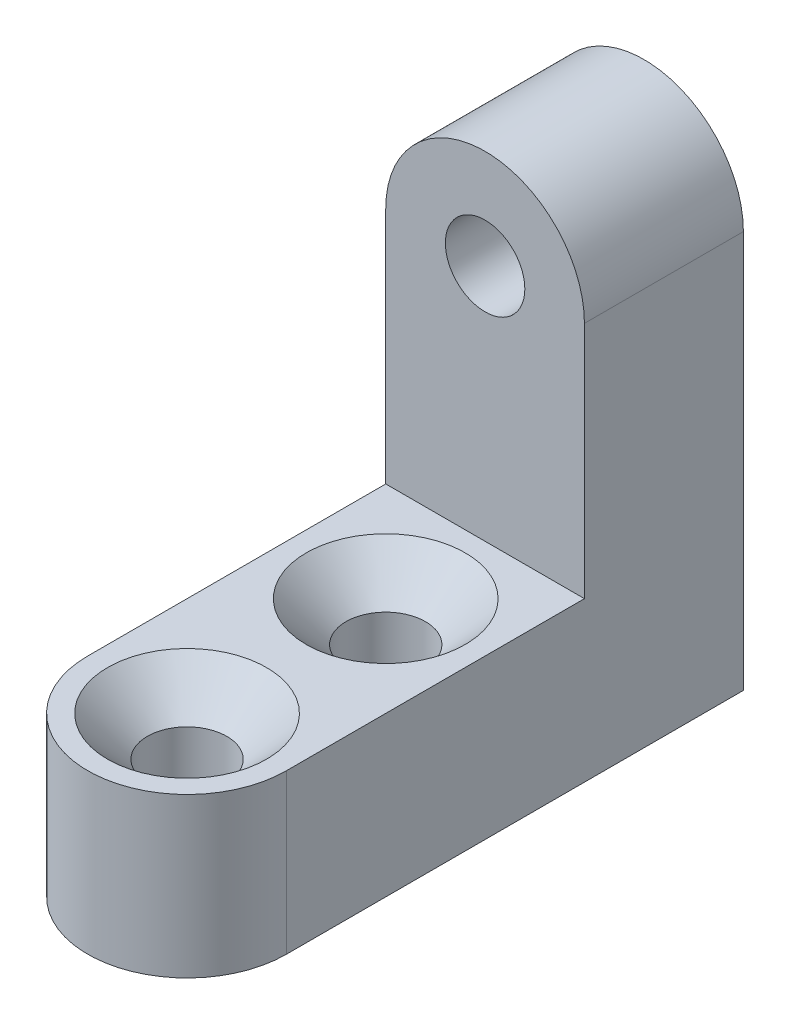
ISO-10303-21;
HEADER;
FILE_DESCRIPTION(('STEP AP214'),'2;1');
FILE_NAME('part.step','',(''),(''),'','','');
FILE_SCHEMA(('AUTOMOTIVE_DESIGN { 1 0 10303 214 1 1 1 1 }'));
ENDSEC;
DATA;
#1=APPLICATION_CONTEXT('core data for automotive mechanical design processes');
#2=APPLICATION_PROTOCOL_DEFINITION('international standard','automotive_design',2000,#1);
#3=PRODUCT_CONTEXT('',#1,'mechanical');
#4=PRODUCT('Part','Part','',(#3));
#5=PRODUCT_RELATED_PRODUCT_CATEGORY('part','',(#4));
#6=PRODUCT_DEFINITION_FORMATION('','',#4);
#7=PRODUCT_DEFINITION_CONTEXT('part definition',#1,'design');
#8=PRODUCT_DEFINITION('design','',#6,#7);
#9=PRODUCT_DEFINITION_SHAPE('','',#8);
#10=(LENGTH_UNIT() NAMED_UNIT(*) SI_UNIT(.MILLI.,.METRE.));
#11=(NAMED_UNIT(*) PLANE_ANGLE_UNIT() SI_UNIT($,.RADIAN.));
#12=(NAMED_UNIT(*) SI_UNIT($,.STERADIAN.) SOLID_ANGLE_UNIT());
#13=UNCERTAINTY_MEASURE_WITH_UNIT(LENGTH_MEASURE(1.E-05),#10,'distance_accuracy_value','');
#14=(GEOMETRIC_REPRESENTATION_CONTEXT(3) GLOBAL_UNCERTAINTY_ASSIGNED_CONTEXT((#13)) GLOBAL_UNIT_ASSIGNED_CONTEXT((#10,
#11,#12)) REPRESENTATION_CONTEXT('',''));
#15=CARTESIAN_POINT('',(0.,0.,0.));
#16=DIRECTION('',(0.,0.,1.));
#17=DIRECTION('',(1.,0.,0.));
#18=AXIS2_PLACEMENT_3D('',#15,#16,#17);
#19=CARTESIAN_POINT('',(0.,20.,8.));
#20=DIRECTION('',(0.,0.,1.));
#21=DIRECTION('',(1.,0.,0.));
#22=AXIS2_PLACEMENT_3D('',#19,#20,#21);
#23=PLANE('',#22);
#24=DIRECTION('',(-1.,0.,0.));
#25=VECTOR('',#24,1.);
#26=CARTESIAN_POINT('',(-5.,8.,8.));
#27=LINE('',#26,#25);
#28=CARTESIAN_POINT('',(5.,8.,8.));
#29=VERTEX_POINT('',#28);
#30=CARTESIAN_POINT('',(-5.,8.,8.));
#31=VERTEX_POINT('',#30);
#32=EDGE_CURVE('E52',#29,#31,#27,.T.);
#33=ORIENTED_EDGE('',*,*,#32,.F.);
#34=DIRECTION('',(0.,1.,0.));
#35=VECTOR('',#34,1.);
#36=CARTESIAN_POINT('',(5.,20.,8.));
#37=LINE('',#36,#35);
#38=CARTESIAN_POINT('',(5.,20.,8.));
#39=VERTEX_POINT('',#38);
#40=EDGE_CURVE('E57',#29,#39,#37,.T.);
#41=ORIENTED_EDGE('',*,*,#40,.T.);
#42=CARTESIAN_POINT('',(0.,20.,8.));
#43=DIRECTION('',(0.,0.,1.));
#44=DIRECTION('',(1.,0.,0.));
#45=AXIS2_PLACEMENT_3D('',#42,#43,#44);
#46=CIRCLE('',#45,5.);
#47=CARTESIAN_POINT('',(-5.,20.,8.));
#48=VERTEX_POINT('',#47);
#49=EDGE_CURVE('E88',#39,#48,#46,.T.);
#50=ORIENTED_EDGE('',*,*,#49,.T.);
#51=DIRECTION('',(0.,-1.,0.));
#52=VECTOR('',#51,1.);
#53=CARTESIAN_POINT('',(-5.,20.,8.));
#54=LINE('',#53,#52);
#55=EDGE_CURVE('E167',#48,#31,#54,.T.);
#56=ORIENTED_EDGE('',*,*,#55,.T.);
#57=EDGE_LOOP('',(#33,#41,#50,#56));
#58=FACE_BOUND('',#57,.T.);
#59=CARTESIAN_POINT('',(0.,20.,8.));
#60=DIRECTION('',(0.,0.,1.));
#61=DIRECTION('',(1.,0.,0.));
#62=AXIS2_PLACEMENT_3D('',#59,#60,#61);
#63=CIRCLE('',#62,2.);
#64=CARTESIAN_POINT('',(2.,20.,8.));
#65=VERTEX_POINT('',#64);
#66=EDGE_CURVE('E101',#65,#65,#63,.T.);
#67=ORIENTED_EDGE('',*,*,#66,.F.);
#68=EDGE_LOOP('',(#67));
#69=FACE_BOUND('',#68,.T.);
#70=ADVANCED_FACE('F36',(#58,#69),#23,.T.);
#71=CARTESIAN_POINT('',(0.,20.,0.));
#72=DIRECTION('',(0.,0.,1.));
#73=DIRECTION('',(1.,0.,0.));
#74=AXIS2_PLACEMENT_3D('',#71,#72,#73);
#75=PLANE('',#74);
#76=CARTESIAN_POINT('',(0.,20.,0.));
#77=DIRECTION('',(0.,0.,1.));
#78=DIRECTION('',(1.,0.,0.));
#79=AXIS2_PLACEMENT_3D('',#76,#77,#78);
#80=CIRCLE('',#79,5.);
#81=CARTESIAN_POINT('',(5.,20.,0.));
#82=VERTEX_POINT('',#81);
#83=CARTESIAN_POINT('',(-5.,20.,0.));
#84=VERTEX_POINT('',#83);
#85=EDGE_CURVE('E95',#82,#84,#80,.T.);
#86=ORIENTED_EDGE('',*,*,#85,.F.);
#87=DIRECTION('',(0.,1.,0.));
#88=VECTOR('',#87,1.);
#89=CARTESIAN_POINT('',(5.,20.,0.));
#90=LINE('',#89,#88);
#91=CARTESIAN_POINT('',(5.,0.,0.));
#92=VERTEX_POINT('',#91);
#93=EDGE_CURVE('E77',#92,#82,#90,.T.);
#94=ORIENTED_EDGE('',*,*,#93,.F.);
#95=DIRECTION('',(1.,0.,0.));
#96=VECTOR('',#95,1.);
#97=CARTESIAN_POINT('',(-5.,0.,0.));
#98=LINE('',#97,#96);
#99=CARTESIAN_POINT('',(-5.,0.,0.));
#100=VERTEX_POINT('',#99);
#101=EDGE_CURVE('E89',#100,#92,#98,.T.);
#102=ORIENTED_EDGE('',*,*,#101,.F.);
#103=DIRECTION('',(0.,-1.,0.));
#104=VECTOR('',#103,1.);
#105=CARTESIAN_POINT('',(-5.,20.,0.));
#106=LINE('',#105,#104);
#107=EDGE_CURVE('E99',#84,#100,#106,.T.);
#108=ORIENTED_EDGE('',*,*,#107,.F.);
#109=EDGE_LOOP('',(#86,#94,#102,#108));
#110=FACE_BOUND('',#109,.T.);
#111=CARTESIAN_POINT('',(0.,20.,0.));
#112=DIRECTION('',(0.,0.,1.));
#113=DIRECTION('',(1.,0.,0.));
#114=AXIS2_PLACEMENT_3D('',#111,#112,#113);
#115=CIRCLE('',#114,2.);
#116=CARTESIAN_POINT('',(2.,20.,0.));
#117=VERTEX_POINT('',#116);
#118=EDGE_CURVE('E105',#117,#117,#115,.T.);
#119=ORIENTED_EDGE('',*,*,#118,.T.);
#120=EDGE_LOOP('',(#119));
#121=FACE_BOUND('',#120,.T.);
#122=ADVANCED_FACE('F97',(#110,#121),#75,.F.);
#123=CARTESIAN_POINT('',(0.,20.,8.));
#124=DIRECTION('',(0.,0.,-1.));
#125=DIRECTION('',(-1.,0.,0.));
#126=AXIS2_PLACEMENT_3D('',#123,#124,#125);
#127=CYLINDRICAL_SURFACE('',#126,5.);
#128=ORIENTED_EDGE('',*,*,#85,.T.);
#129=DIRECTION('',(0.,0.,-1.));
#130=VECTOR('',#129,1.);
#131=CARTESIAN_POINT('',(-5.,20.,8.));
#132=LINE('',#131,#130);
#133=EDGE_CURVE('E115',#48,#84,#132,.T.);
#134=ORIENTED_EDGE('',*,*,#133,.F.);
#135=ORIENTED_EDGE('',*,*,#49,.F.);
#136=DIRECTION('',(0.,0.,-1.));
#137=VECTOR('',#136,1.);
#138=CARTESIAN_POINT('',(5.,20.,8.));
#139=LINE('',#138,#137);
#140=EDGE_CURVE('E80',#39,#82,#139,.T.);
#141=ORIENTED_EDGE('',*,*,#140,.T.);
#142=EDGE_LOOP('',(#128,#134,#135,#141));
#143=FACE_BOUND('',#142,.T.);
#144=ADVANCED_FACE('F93',(#143),#127,.T.);
#145=CARTESIAN_POINT('',(-5.,20.,8.));
#146=DIRECTION('',(1.,0.,0.));
#147=DIRECTION('',(0.,1.,0.));
#148=AXIS2_PLACEMENT_3D('',#145,#146,#147);
#149=PLANE('',#148);
#150=ORIENTED_EDGE('',*,*,#107,.T.);
#151=DIRECTION('',(0.,0.,-1.));
#152=VECTOR('',#151,1.);
#153=CARTESIAN_POINT('',(-5.,0.,8.));
#154=LINE('',#153,#152);
#155=CARTESIAN_POINT('',(-5.,0.,23.));
#156=VERTEX_POINT('',#155);
#157=EDGE_CURVE('E112',#156,#100,#154,.T.);
#158=ORIENTED_EDGE('',*,*,#157,.F.);
#159=DIRECTION('',(0.,-1.,0.));
#160=VECTOR('',#159,1.);
#161=CARTESIAN_POINT('',(-5.,8.,23.));
#162=LINE('',#161,#160);
#163=CARTESIAN_POINT('',(-5.,8.,23.));
#164=VERTEX_POINT('',#163);
#165=EDGE_CURVE('E162',#164,#156,#162,.T.);
#166=ORIENTED_EDGE('',*,*,#165,.F.);
#167=DIRECTION('',(0.,0.,1.));
#168=VECTOR('',#167,1.);
#169=CARTESIAN_POINT('',(-5.,8.,8.));
#170=LINE('',#169,#168);
#171=EDGE_CURVE('E148',#31,#164,#170,.T.);
#172=ORIENTED_EDGE('',*,*,#171,.F.);
#173=ORIENTED_EDGE('',*,*,#55,.F.);
#174=ORIENTED_EDGE('',*,*,#133,.T.);
#175=EDGE_LOOP('',(#150,#158,#166,#172,#173,#174));
#176=FACE_BOUND('',#175,.T.);
#177=ADVANCED_FACE('F177',(#176),#149,.F.);
#178=CARTESIAN_POINT('',(-5.,0.,8.));
#179=DIRECTION('',(0.,1.,0.));
#180=DIRECTION('',(-1.,0.,0.));
#181=AXIS2_PLACEMENT_3D('',#178,#179,#180);
#182=PLANE('',#181);
#183=ORIENTED_EDGE('',*,*,#101,.T.);
#184=DIRECTION('',(0.,0.,-1.));
#185=VECTOR('',#184,1.);
#186=CARTESIAN_POINT('',(5.,0.,8.));
#187=LINE('',#186,#185);
#188=CARTESIAN_POINT('',(5.,0.,23.));
#189=VERTEX_POINT('',#188);
#190=EDGE_CURVE('E84',#189,#92,#187,.T.);
#191=ORIENTED_EDGE('',*,*,#190,.F.);
#192=CARTESIAN_POINT('',(0.,0.,23.));
#193=DIRECTION('',(0.,1.,0.));
#194=DIRECTION('',(0.,0.,1.));
#195=AXIS2_PLACEMENT_3D('',#192,#193,#194);
#196=CIRCLE('',#195,5.);
#197=EDGE_CURVE('E145',#156,#189,#196,.T.);
#198=ORIENTED_EDGE('',*,*,#197,.F.);
#199=ORIENTED_EDGE('',*,*,#157,.T.);
#200=EDGE_LOOP('',(#183,#191,#198,#199));
#201=FACE_BOUND('',#200,.T.);
#202=CARTESIAN_POINT('',(0.,0.,23.));
#203=DIRECTION('',(0.,1.,0.));
#204=DIRECTION('',(0.,0.,1.));
#205=AXIS2_PLACEMENT_3D('',#202,#203,#204);
#206=CIRCLE('',#205,2.);
#207=CARTESIAN_POINT('',(0.,0.,25.));
#208=VERTEX_POINT('',#207);
#209=EDGE_CURVE('E142',#208,#208,#206,.T.);
#210=ORIENTED_EDGE('',*,*,#209,.T.);
#211=EDGE_LOOP('',(#210));
#212=FACE_BOUND('',#211,.T.);
#213=CARTESIAN_POINT('',(0.,0.,13.));
#214=DIRECTION('',(0.,1.,0.));
#215=DIRECTION('',(0.,0.,1.));
#216=AXIS2_PLACEMENT_3D('',#213,#214,#215);
#217=CIRCLE('',#216,2.);
#218=CARTESIAN_POINT('',(0.,0.,15.));
#219=VERTEX_POINT('',#218);
#220=EDGE_CURVE('E140',#219,#219,#217,.T.);
#221=ORIENTED_EDGE('',*,*,#220,.T.);
#222=EDGE_LOOP('',(#221));
#223=FACE_BOUND('',#222,.T.);
#224=ADVANCED_FACE('F190',(#201,#212,#223),#182,.F.);
#225=CARTESIAN_POINT('',(5.,20.,8.));
#226=DIRECTION('',(-1.,0.,0.));
#227=DIRECTION('',(0.,-1.,0.));
#228=AXIS2_PLACEMENT_3D('',#225,#226,#227);
#229=PLANE('',#228);
#230=ORIENTED_EDGE('',*,*,#93,.T.);
#231=ORIENTED_EDGE('',*,*,#140,.F.);
#232=ORIENTED_EDGE('',*,*,#40,.F.);
#233=DIRECTION('',(0.,0.,-1.));
#234=VECTOR('',#233,1.);
#235=CARTESIAN_POINT('',(5.,8.,8.));
#236=LINE('',#235,#234);
#237=CARTESIAN_POINT('',(5.,8.,23.));
#238=VERTEX_POINT('',#237);
#239=EDGE_CURVE('E154',#238,#29,#236,.T.);
#240=ORIENTED_EDGE('',*,*,#239,.F.);
#241=DIRECTION('',(0.,-1.,0.));
#242=VECTOR('',#241,1.);
#243=CARTESIAN_POINT('',(5.,8.,23.));
#244=LINE('',#243,#242);
#245=EDGE_CURVE('E158',#238,#189,#244,.T.);
#246=ORIENTED_EDGE('',*,*,#245,.T.);
#247=ORIENTED_EDGE('',*,*,#190,.T.);
#248=EDGE_LOOP('',(#230,#231,#232,#240,#246,#247));
#249=FACE_BOUND('',#248,.T.);
#250=ADVANCED_FACE('F79',(#249),#229,.F.);
#251=CARTESIAN_POINT('',(0.,20.,8.));
#252=DIRECTION('',(0.,0.,-1.));
#253=DIRECTION('',(-1.,0.,0.));
#254=AXIS2_PLACEMENT_3D('',#251,#252,#253);
#255=CYLINDRICAL_SURFACE('',#254,2.);
#256=ORIENTED_EDGE('',*,*,#66,.T.);
#257=EDGE_LOOP('',(#256));
#258=FACE_BOUND('',#257,.T.);
#259=ORIENTED_EDGE('',*,*,#118,.F.);
#260=EDGE_LOOP('',(#259));
#261=FACE_BOUND('',#260,.T.);
#262=ADVANCED_FACE('F211',(#258,#261),#255,.F.);
#263=CARTESIAN_POINT('',(0.,8.,23.));
#264=DIRECTION('',(0.,1.,0.));
#265=DIRECTION('',(0.,0.,1.));
#266=AXIS2_PLACEMENT_3D('',#263,#264,#265);
#267=PLANE('',#266);
#268=CARTESIAN_POINT('',(0.,8.,13.));
#269=DIRECTION('',(0.,1.,0.));
#270=DIRECTION('',(0.,0.,1.));
#271=AXIS2_PLACEMENT_3D('',#268,#269,#270);
#272=CIRCLE('',#271,4.00000000000001);
#273=CARTESIAN_POINT('',(0.,8.,17.));
#274=VERTEX_POINT('',#273);
#275=EDGE_CURVE('E45',#274,#274,#272,.F.);
#276=ORIENTED_EDGE('',*,*,#275,.T.);
#277=EDGE_LOOP('',(#276));
#278=FACE_BOUND('',#277,.T.);
#279=CARTESIAN_POINT('',(0.,8.,23.));
#280=DIRECTION('',(0.,1.,0.));
#281=DIRECTION('',(0.,0.,1.));
#282=AXIS2_PLACEMENT_3D('',#279,#280,#281);
#283=CIRCLE('',#282,4.00000000000001);
#284=CARTESIAN_POINT('',(0.,8.,27.));
#285=VERTEX_POINT('',#284);
#286=EDGE_CURVE('E120',#285,#285,#283,.F.);
#287=ORIENTED_EDGE('',*,*,#286,.T.);
#288=EDGE_LOOP('',(#287));
#289=FACE_BOUND('',#288,.T.);
#290=ORIENTED_EDGE('',*,*,#171,.T.);
#291=CARTESIAN_POINT('',(0.,8.,23.));
#292=DIRECTION('',(0.,1.,0.));
#293=DIRECTION('',(0.,0.,1.));
#294=AXIS2_PLACEMENT_3D('',#291,#292,#293);
#295=CIRCLE('',#294,5.);
#296=EDGE_CURVE('E151',#164,#238,#295,.T.);
#297=ORIENTED_EDGE('',*,*,#296,.T.);
#298=ORIENTED_EDGE('',*,*,#239,.T.);
#299=ORIENTED_EDGE('',*,*,#32,.T.);
#300=EDGE_LOOP('',(#290,#297,#298,#299));
#301=FACE_BOUND('',#300,.T.);
#302=ADVANCED_FACE('F125',(#278,#289,#301),#267,.T.);
#303=CARTESIAN_POINT('',(0.,8.,23.));
#304=DIRECTION('',(0.,-1.,0.));
#305=DIRECTION('',(0.,0.,-1.));
#306=AXIS2_PLACEMENT_3D('',#303,#304,#305);
#307=CYLINDRICAL_SURFACE('',#306,5.);
#308=ORIENTED_EDGE('',*,*,#197,.T.);
#309=ORIENTED_EDGE('',*,*,#245,.F.);
#310=ORIENTED_EDGE('',*,*,#296,.F.);
#311=ORIENTED_EDGE('',*,*,#165,.T.);
#312=EDGE_LOOP('',(#308,#309,#310,#311));
#313=FACE_BOUND('',#312,.T.);
#314=ADVANCED_FACE('F185',(#313),#307,.T.);
#315=CARTESIAN_POINT('',(0.,8.,23.));
#316=DIRECTION('',(0.,-1.,0.));
#317=DIRECTION('',(0.,0.,-1.));
#318=AXIS2_PLACEMENT_3D('',#315,#316,#317);
#319=CYLINDRICAL_SURFACE('',#318,2.);
#320=CARTESIAN_POINT('',(0.,6.,23.));
#321=DIRECTION('',(0.,1.,0.));
#322=DIRECTION('',(0.,0.,1.));
#323=AXIS2_PLACEMENT_3D('',#320,#321,#322);
#324=CIRCLE('',#323,2.);
#325=CARTESIAN_POINT('',(0.,6.,25.));
#326=VERTEX_POINT('',#325);
#327=EDGE_CURVE('E11',#326,#326,#324,.T.);
#328=ORIENTED_EDGE('',*,*,#327,.T.);
#329=EDGE_LOOP('',(#328));
#330=FACE_BOUND('',#329,.T.);
#331=ORIENTED_EDGE('',*,*,#209,.F.);
#332=EDGE_LOOP('',(#331));
#333=FACE_BOUND('',#332,.T.);
#334=ADVANCED_FACE('F136',(#330,#333),#319,.F.);
#335=CARTESIAN_POINT('',(0.,8.,13.));
#336=DIRECTION('',(0.,-1.,0.));
#337=DIRECTION('',(0.,0.,-1.));
#338=AXIS2_PLACEMENT_3D('',#335,#336,#337);
#339=CYLINDRICAL_SURFACE('',#338,2.);
#340=CARTESIAN_POINT('',(0.,6.,13.));
#341=DIRECTION('',(0.,1.,0.));
#342=DIRECTION('',(0.,0.,1.));
#343=AXIS2_PLACEMENT_3D('',#340,#341,#342);
#344=CIRCLE('',#343,2.);
#345=CARTESIAN_POINT('',(0.,6.,15.));
#346=VERTEX_POINT('',#345);
#347=EDGE_CURVE('E117',#346,#346,#344,.T.);
#348=ORIENTED_EDGE('',*,*,#347,.T.);
#349=EDGE_LOOP('',(#348));
#350=FACE_BOUND('',#349,.T.);
#351=ORIENTED_EDGE('',*,*,#220,.F.);
#352=EDGE_LOOP('',(#351));
#353=FACE_BOUND('',#352,.T.);
#354=ADVANCED_FACE('F131',(#350,#353),#339,.F.);
#355=CARTESIAN_POINT('',(0.,6.,13.));
#356=DIRECTION('',(0.,1.,0.));
#357=DIRECTION('',(0.,0.,1.));
#358=AXIS2_PLACEMENT_3D('',#355,#356,#357);
#359=CONICAL_SURFACE('',#358,2.,0.785398163397451);
#360=ORIENTED_EDGE('',*,*,#275,.F.);
#361=EDGE_LOOP('',(#360));
#362=FACE_BOUND('',#361,.T.);
#363=ORIENTED_EDGE('',*,*,#347,.F.);
#364=EDGE_LOOP('',(#363));
#365=FACE_BOUND('',#364,.T.);
#366=ADVANCED_FACE('F128',(#362,#365),#359,.F.);
#367=CARTESIAN_POINT('',(0.,6.,23.));
#368=DIRECTION('',(0.,1.,0.));
#369=DIRECTION('',(0.,0.,1.));
#370=AXIS2_PLACEMENT_3D('',#367,#368,#369);
#371=CONICAL_SURFACE('',#370,2.,0.78539816339745);
#372=ORIENTED_EDGE('',*,*,#286,.F.);
#373=EDGE_LOOP('',(#372));
#374=FACE_BOUND('',#373,.T.);
#375=ORIENTED_EDGE('',*,*,#327,.F.);
#376=EDGE_LOOP('',(#375));
#377=FACE_BOUND('',#376,.T.);
#378=ADVANCED_FACE('F39',(#374,#377),#371,.F.);
#379=CLOSED_SHELL('',(#70,#122,#144,#177,#224,#250,#262,#302,#314,#334,#354,#366,#378));
#380=MANIFOLD_SOLID_BREP('B2',#379);
#381=ADVANCED_BREP_SHAPE_REPRESENTATION('',(#18,#380),#14);
#382=SHAPE_DEFINITION_REPRESENTATION(#9,#381);
ENDSEC;
END-ISO-10303-21;
